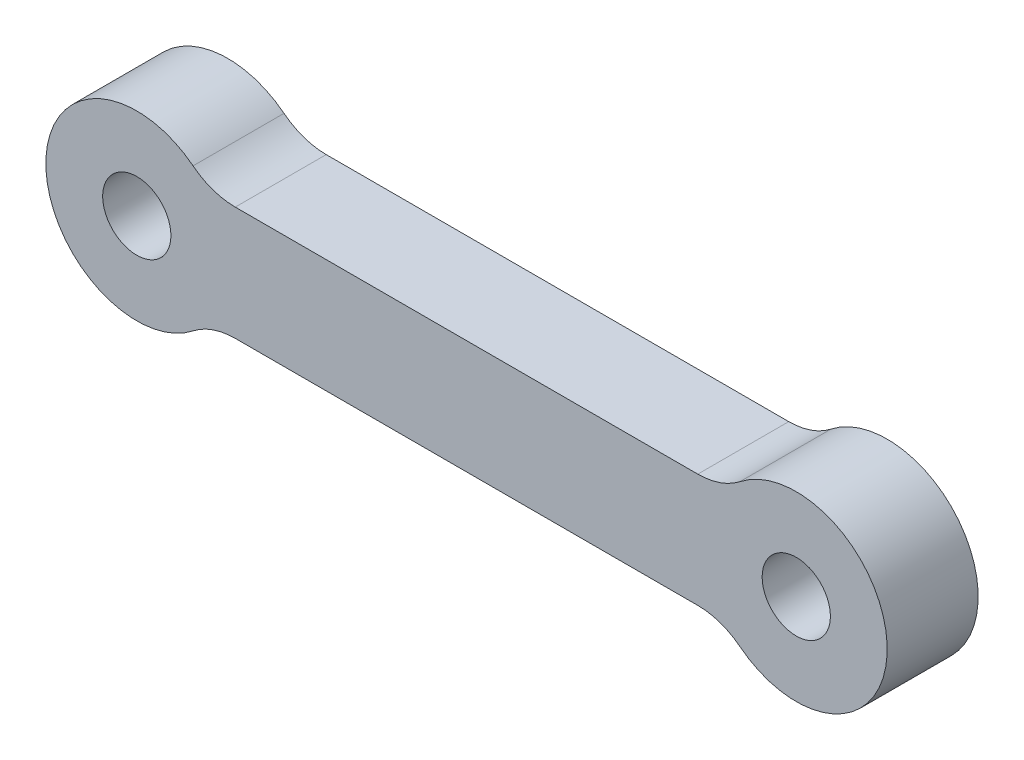
ISO-10303-21;
HEADER;
FILE_DESCRIPTION(('STEP AP214'),'2;1');
FILE_NAME('part.step','',(''),(''),'','','');
FILE_SCHEMA(('AUTOMOTIVE_DESIGN { 1 0 10303 214 1 1 1 1 }'));
ENDSEC;
DATA;
#1=APPLICATION_CONTEXT('core data for automotive mechanical design processes');
#2=APPLICATION_PROTOCOL_DEFINITION('international standard','automotive_design',2000,#1);
#3=PRODUCT_CONTEXT('',#1,'mechanical');
#4=PRODUCT('Part','Part','',(#3));
#5=PRODUCT_RELATED_PRODUCT_CATEGORY('part','',(#4));
#6=PRODUCT_DEFINITION_FORMATION('','',#4);
#7=PRODUCT_DEFINITION_CONTEXT('part definition',#1,'design');
#8=PRODUCT_DEFINITION('design','',#6,#7);
#9=PRODUCT_DEFINITION_SHAPE('','',#8);
#10=(LENGTH_UNIT() NAMED_UNIT(*) SI_UNIT(.MILLI.,.METRE.));
#11=(NAMED_UNIT(*) PLANE_ANGLE_UNIT() SI_UNIT($,.RADIAN.));
#12=(NAMED_UNIT(*) SI_UNIT($,.STERADIAN.) SOLID_ANGLE_UNIT());
#13=UNCERTAINTY_MEASURE_WITH_UNIT(LENGTH_MEASURE(1.E-05),#10,'distance_accuracy_value','');
#14=(GEOMETRIC_REPRESENTATION_CONTEXT(3) GLOBAL_UNCERTAINTY_ASSIGNED_CONTEXT((#13)) GLOBAL_UNIT_ASSIGNED_CONTEXT((#10,
#11,#12)) REPRESENTATION_CONTEXT('',''));
#15=CARTESIAN_POINT('',(0.,0.,0.));
#16=DIRECTION('',(0.,0.,1.));
#17=DIRECTION('',(1.,0.,0.));
#18=AXIS2_PLACEMENT_3D('',#15,#16,#17);
#19=CARTESIAN_POINT('',(10.1698729810778,-5.5,4.));
#20=DIRECTION('',(0.,0.,-1.));
#21=DIRECTION('',(-1.,0.,0.));
#22=AXIS2_PLACEMENT_3D('',#19,#20,#21);
#23=PLANE('',#22);
#24=CARTESIAN_POINT('',(10.1698729810778,-5.5,4.));
#25=DIRECTION('',(0.,0.,-1.));
#26=DIRECTION('',(-1.,0.,0.));
#27=AXIS2_PLACEMENT_3D('',#24,#25,#26);
#28=CIRCLE('',#27,3.);
#29=CARTESIAN_POINT('',(10.1698729810778,-2.5,4.));
#30=VERTEX_POINT('',#29);
#31=CARTESIAN_POINT('',(12.025641703473,-3.14285714285714,4.));
#32=VERTEX_POINT('',#31);
#33=EDGE_CURVE('E151',#30,#32,#28,.T.);
#34=ORIENTED_EDGE('',*,*,#33,.T.);
#35=CARTESIAN_POINT('',(14.5,0.,4.));
#36=DIRECTION('',(0.,0.,1.));
#37=DIRECTION('',(-1.,0.,0.));
#38=AXIS2_PLACEMENT_3D('',#35,#36,#37);
#39=CIRCLE('',#38,4.);
#40=CARTESIAN_POINT('',(12.025641703473,3.14285714285714,4.));
#41=VERTEX_POINT('',#40);
#42=EDGE_CURVE('E97',#32,#41,#39,.T.);
#43=ORIENTED_EDGE('',*,*,#42,.T.);
#44=CARTESIAN_POINT('',(10.1698729810778,5.5,4.));
#45=DIRECTION('',(0.,0.,-1.));
#46=DIRECTION('',(1.,0.,0.));
#47=AXIS2_PLACEMENT_3D('',#44,#45,#46);
#48=CIRCLE('',#47,3.);
#49=CARTESIAN_POINT('',(10.1698729810778,2.5,4.));
#50=VERTEX_POINT('',#49);
#51=EDGE_CURVE('E167',#41,#50,#48,.T.);
#52=ORIENTED_EDGE('',*,*,#51,.T.);
#53=DIRECTION('',(-1.,0.,0.));
#54=VECTOR('',#53,1.);
#55=CARTESIAN_POINT('',(-10.1698729810778,2.5,4.));
#56=LINE('',#55,#54);
#57=CARTESIAN_POINT('',(-10.1698729810778,2.5,4.));
#58=VERTEX_POINT('',#57);
#59=EDGE_CURVE('E176',#50,#58,#56,.T.);
#60=ORIENTED_EDGE('',*,*,#59,.T.);
#61=CARTESIAN_POINT('',(-10.1698729810778,5.5,4.));
#62=DIRECTION('',(0.,0.,-1.));
#63=DIRECTION('',(1.,0.,0.));
#64=AXIS2_PLACEMENT_3D('',#61,#62,#63);
#65=CIRCLE('',#64,3.);
#66=CARTESIAN_POINT('',(-12.025641703473,3.14285714285714,4.));
#67=VERTEX_POINT('',#66);
#68=EDGE_CURVE('E117',#58,#67,#65,.T.);
#69=ORIENTED_EDGE('',*,*,#68,.T.);
#70=CARTESIAN_POINT('',(-14.5,0.,4.));
#71=DIRECTION('',(0.,0.,1.));
#72=DIRECTION('',(1.,0.,0.));
#73=AXIS2_PLACEMENT_3D('',#70,#71,#72);
#74=CIRCLE('',#73,4.);
#75=CARTESIAN_POINT('',(-12.025641703473,-3.14285714285714,4.));
#76=VERTEX_POINT('',#75);
#77=EDGE_CURVE('E115',#67,#76,#74,.T.);
#78=ORIENTED_EDGE('',*,*,#77,.T.);
#79=CARTESIAN_POINT('',(-10.1698729810778,-5.5,4.));
#80=DIRECTION('',(0.,0.,-1.));
#81=DIRECTION('',(1.,0.,0.));
#82=AXIS2_PLACEMENT_3D('',#79,#80,#81);
#83=CIRCLE('',#82,3.);
#84=CARTESIAN_POINT('',(-10.1698729810778,-2.5,4.));
#85=VERTEX_POINT('',#84);
#86=EDGE_CURVE('E118',#76,#85,#83,.T.);
#87=ORIENTED_EDGE('',*,*,#86,.T.);
#88=DIRECTION('',(1.,0.,0.));
#89=VECTOR('',#88,1.);
#90=CARTESIAN_POINT('',(-10.1698729810778,-2.5,4.));
#91=LINE('',#90,#89);
#92=EDGE_CURVE('E57',#85,#30,#91,.T.);
#93=ORIENTED_EDGE('',*,*,#92,.T.);
#94=EDGE_LOOP('',(#34,#43,#52,#60,#69,#78,#87,#93));
#95=FACE_BOUND('',#94,.T.);
#96=CARTESIAN_POINT('',(-14.5,0.,4.));
#97=DIRECTION('',(0.,0.,1.));
#98=DIRECTION('',(1.,0.,0.));
#99=AXIS2_PLACEMENT_3D('',#96,#97,#98);
#100=CIRCLE('',#99,1.5);
#101=CARTESIAN_POINT('',(-13.,0.,4.));
#102=VERTEX_POINT('',#101);
#103=EDGE_CURVE('E138',#102,#102,#100,.T.);
#104=ORIENTED_EDGE('',*,*,#103,.F.);
#105=EDGE_LOOP('',(#104));
#106=FACE_BOUND('',#105,.T.);
#107=CARTESIAN_POINT('',(14.5,0.,4.));
#108=DIRECTION('',(0.,0.,1.));
#109=DIRECTION('',(-1.,0.,0.));
#110=AXIS2_PLACEMENT_3D('',#107,#108,#109);
#111=CIRCLE('',#110,1.49999999999998);
#112=CARTESIAN_POINT('',(13.,0.,4.));
#113=VERTEX_POINT('',#112);
#114=EDGE_CURVE('E187',#113,#113,#111,.T.);
#115=ORIENTED_EDGE('',*,*,#114,.F.);
#116=EDGE_LOOP('',(#115));
#117=FACE_BOUND('',#116,.T.);
#118=ADVANCED_FACE('F39',(#95,#106,#117),#23,.F.);
#119=CARTESIAN_POINT('',(10.1698729810778,-5.5,0.));
#120=DIRECTION('',(0.,0.,-1.));
#121=DIRECTION('',(-1.,0.,0.));
#122=AXIS2_PLACEMENT_3D('',#119,#120,#121);
#123=PLANE('',#122);
#124=CARTESIAN_POINT('',(-14.5,0.,0.));
#125=DIRECTION('',(0.,0.,1.));
#126=DIRECTION('',(1.,0.,0.));
#127=AXIS2_PLACEMENT_3D('',#124,#125,#126);
#128=CIRCLE('',#127,1.5);
#129=CARTESIAN_POINT('',(-13.,0.,0.));
#130=VERTEX_POINT('',#129);
#131=EDGE_CURVE('E183',#130,#130,#128,.T.);
#132=ORIENTED_EDGE('',*,*,#131,.T.);
#133=EDGE_LOOP('',(#132));
#134=FACE_BOUND('',#133,.T.);
#135=CARTESIAN_POINT('',(10.1698729810778,-5.5,0.));
#136=DIRECTION('',(0.,0.,-1.));
#137=DIRECTION('',(-1.,0.,0.));
#138=AXIS2_PLACEMENT_3D('',#135,#136,#137);
#139=CIRCLE('',#138,3.);
#140=CARTESIAN_POINT('',(10.1698729810778,-2.5,0.));
#141=VERTEX_POINT('',#140);
#142=CARTESIAN_POINT('',(12.025641703473,-3.14285714285714,0.));
#143=VERTEX_POINT('',#142);
#144=EDGE_CURVE('E137',#141,#143,#139,.T.);
#145=ORIENTED_EDGE('',*,*,#144,.F.);
#146=DIRECTION('',(1.,0.,0.));
#147=VECTOR('',#146,1.);
#148=CARTESIAN_POINT('',(-10.1698729810778,-2.5,0.));
#149=LINE('',#148,#147);
#150=CARTESIAN_POINT('',(-10.1698729810778,-2.5,0.));
#151=VERTEX_POINT('',#150);
#152=EDGE_CURVE('E93',#151,#141,#149,.T.);
#153=ORIENTED_EDGE('',*,*,#152,.F.);
#154=CARTESIAN_POINT('',(-10.1698729810778,-5.5,0.));
#155=DIRECTION('',(0.,0.,-1.));
#156=DIRECTION('',(1.,0.,0.));
#157=AXIS2_PLACEMENT_3D('',#154,#155,#156);
#158=CIRCLE('',#157,3.);
#159=CARTESIAN_POINT('',(-12.025641703473,-3.14285714285714,0.));
#160=VERTEX_POINT('',#159);
#161=EDGE_CURVE('E83',#160,#151,#158,.T.);
#162=ORIENTED_EDGE('',*,*,#161,.F.);
#163=CARTESIAN_POINT('',(-14.5,0.,0.));
#164=DIRECTION('',(0.,0.,1.));
#165=DIRECTION('',(1.,0.,0.));
#166=AXIS2_PLACEMENT_3D('',#163,#164,#165);
#167=CIRCLE('',#166,4.);
#168=CARTESIAN_POINT('',(-12.025641703473,3.14285714285714,0.));
#169=VERTEX_POINT('',#168);
#170=EDGE_CURVE('E127',#169,#160,#167,.T.);
#171=ORIENTED_EDGE('',*,*,#170,.F.);
#172=CARTESIAN_POINT('',(-10.1698729810778,5.5,0.));
#173=DIRECTION('',(0.,0.,-1.));
#174=DIRECTION('',(1.,0.,0.));
#175=AXIS2_PLACEMENT_3D('',#172,#173,#174);
#176=CIRCLE('',#175,3.);
#177=CARTESIAN_POINT('',(-10.1698729810778,2.5,0.));
#178=VERTEX_POINT('',#177);
#179=EDGE_CURVE('E148',#178,#169,#176,.T.);
#180=ORIENTED_EDGE('',*,*,#179,.F.);
#181=DIRECTION('',(-1.,0.,0.));
#182=VECTOR('',#181,1.);
#183=CARTESIAN_POINT('',(-10.1698729810778,2.5,0.));
#184=LINE('',#183,#182);
#185=CARTESIAN_POINT('',(10.1698729810778,2.5,0.));
#186=VERTEX_POINT('',#185);
#187=EDGE_CURVE('E145',#186,#178,#184,.T.);
#188=ORIENTED_EDGE('',*,*,#187,.F.);
#189=CARTESIAN_POINT('',(10.1698729810778,5.5,0.));
#190=DIRECTION('',(0.,0.,-1.));
#191=DIRECTION('',(1.,0.,0.));
#192=AXIS2_PLACEMENT_3D('',#189,#190,#191);
#193=CIRCLE('',#192,3.);
#194=CARTESIAN_POINT('',(12.025641703473,3.14285714285714,0.));
#195=VERTEX_POINT('',#194);
#196=EDGE_CURVE('E142',#195,#186,#193,.T.);
#197=ORIENTED_EDGE('',*,*,#196,.F.);
#198=CARTESIAN_POINT('',(14.5,0.,0.));
#199=DIRECTION('',(0.,0.,1.));
#200=DIRECTION('',(-1.,0.,0.));
#201=AXIS2_PLACEMENT_3D('',#198,#199,#200);
#202=CIRCLE('',#201,4.);
#203=EDGE_CURVE('E136',#143,#195,#202,.T.);
#204=ORIENTED_EDGE('',*,*,#203,.F.);
#205=EDGE_LOOP('',(#145,#153,#162,#171,#180,#188,#197,#204));
#206=FACE_BOUND('',#205,.T.);
#207=CARTESIAN_POINT('',(14.5,0.,0.));
#208=DIRECTION('',(0.,0.,1.));
#209=DIRECTION('',(-1.,0.,0.));
#210=AXIS2_PLACEMENT_3D('',#207,#208,#209);
#211=CIRCLE('',#210,1.49999999999998);
#212=CARTESIAN_POINT('',(13.,0.,0.));
#213=VERTEX_POINT('',#212);
#214=EDGE_CURVE('E192',#213,#213,#211,.T.);
#215=ORIENTED_EDGE('',*,*,#214,.T.);
#216=EDGE_LOOP('',(#215));
#217=FACE_BOUND('',#216,.T.);
#218=ADVANCED_FACE('F168',(#134,#206,#217),#123,.T.);
#219=CARTESIAN_POINT('',(10.1698729810778,-5.5,4.));
#220=DIRECTION('',(0.,0.,-1.));
#221=DIRECTION('',(-1.,0.,0.));
#222=AXIS2_PLACEMENT_3D('',#219,#220,#221);
#223=CYLINDRICAL_SURFACE('',#222,3.);
#224=ORIENTED_EDGE('',*,*,#144,.T.);
#225=DIRECTION('',(0.,0.,-1.));
#226=VECTOR('',#225,1.);
#227=CARTESIAN_POINT('',(12.025641703473,-3.14285714285714,4.));
#228=LINE('',#227,#226);
#229=EDGE_CURVE('E11',#32,#143,#228,.T.);
#230=ORIENTED_EDGE('',*,*,#229,.F.);
#231=ORIENTED_EDGE('',*,*,#33,.F.);
#232=DIRECTION('',(0.,0.,-1.));
#233=VECTOR('',#232,1.);
#234=CARTESIAN_POINT('',(10.1698729810778,-2.5,4.));
#235=LINE('',#234,#233);
#236=EDGE_CURVE('E134',#30,#141,#235,.T.);
#237=ORIENTED_EDGE('',*,*,#236,.T.);
#238=EDGE_LOOP('',(#224,#230,#231,#237));
#239=FACE_BOUND('',#238,.T.);
#240=ADVANCED_FACE('F41',(#239),#223,.F.);
#241=CARTESIAN_POINT('',(14.5,0.,4.));
#242=DIRECTION('',(0.,0.,-1.));
#243=DIRECTION('',(-1.,0.,0.));
#244=AXIS2_PLACEMENT_3D('',#241,#242,#243);
#245=CYLINDRICAL_SURFACE('',#244,4.);
#246=ORIENTED_EDGE('',*,*,#203,.T.);
#247=DIRECTION('',(0.,0.,-1.));
#248=VECTOR('',#247,1.);
#249=CARTESIAN_POINT('',(12.025641703473,3.14285714285714,4.));
#250=LINE('',#249,#248);
#251=EDGE_CURVE('E48',#41,#195,#250,.T.);
#252=ORIENTED_EDGE('',*,*,#251,.F.);
#253=ORIENTED_EDGE('',*,*,#42,.F.);
#254=ORIENTED_EDGE('',*,*,#229,.T.);
#255=EDGE_LOOP('',(#246,#252,#253,#254));
#256=FACE_BOUND('',#255,.T.);
#257=ADVANCED_FACE('F224',(#256),#245,.T.);
#258=CARTESIAN_POINT('',(10.1698729810778,5.5,4.));
#259=DIRECTION('',(0.,0.,-1.));
#260=DIRECTION('',(-1.,0.,0.));
#261=AXIS2_PLACEMENT_3D('',#258,#259,#260);
#262=CYLINDRICAL_SURFACE('',#261,3.);
#263=ORIENTED_EDGE('',*,*,#196,.T.);
#264=DIRECTION('',(0.,0.,-1.));
#265=VECTOR('',#264,1.);
#266=CARTESIAN_POINT('',(10.1698729810778,2.5,4.));
#267=LINE('',#266,#265);
#268=EDGE_CURVE('E158',#50,#186,#267,.T.);
#269=ORIENTED_EDGE('',*,*,#268,.F.);
#270=ORIENTED_EDGE('',*,*,#51,.F.);
#271=ORIENTED_EDGE('',*,*,#251,.T.);
#272=EDGE_LOOP('',(#263,#269,#270,#271));
#273=FACE_BOUND('',#272,.T.);
#274=ADVANCED_FACE('F163',(#273),#262,.F.);
#275=CARTESIAN_POINT('',(-10.1698729810778,2.5,4.));
#276=DIRECTION('',(0.,-1.,0.));
#277=DIRECTION('',(0.,0.,-1.));
#278=AXIS2_PLACEMENT_3D('',#275,#276,#277);
#279=PLANE('',#278);
#280=ORIENTED_EDGE('',*,*,#187,.T.);
#281=DIRECTION('',(0.,0.,-1.));
#282=VECTOR('',#281,1.);
#283=CARTESIAN_POINT('',(-10.1698729810778,2.5,4.));
#284=LINE('',#283,#282);
#285=EDGE_CURVE('E154',#58,#178,#284,.T.);
#286=ORIENTED_EDGE('',*,*,#285,.F.);
#287=ORIENTED_EDGE('',*,*,#59,.F.);
#288=ORIENTED_EDGE('',*,*,#268,.T.);
#289=EDGE_LOOP('',(#280,#286,#287,#288));
#290=FACE_BOUND('',#289,.T.);
#291=ADVANCED_FACE('F171',(#290),#279,.F.);
#292=CARTESIAN_POINT('',(-10.1698729810778,5.5,4.));
#293=DIRECTION('',(0.,0.,-1.));
#294=DIRECTION('',(-1.,0.,0.));
#295=AXIS2_PLACEMENT_3D('',#292,#293,#294);
#296=CYLINDRICAL_SURFACE('',#295,3.);
#297=ORIENTED_EDGE('',*,*,#179,.T.);
#298=DIRECTION('',(0.,0.,-1.));
#299=VECTOR('',#298,1.);
#300=CARTESIAN_POINT('',(-12.025641703473,3.14285714285714,4.));
#301=LINE('',#300,#299);
#302=EDGE_CURVE('E130',#67,#169,#301,.T.);
#303=ORIENTED_EDGE('',*,*,#302,.F.);
#304=ORIENTED_EDGE('',*,*,#68,.F.);
#305=ORIENTED_EDGE('',*,*,#285,.T.);
#306=EDGE_LOOP('',(#297,#303,#304,#305));
#307=FACE_BOUND('',#306,.T.);
#308=ADVANCED_FACE('F179',(#307),#296,.F.);
#309=CARTESIAN_POINT('',(-14.5,0.,4.));
#310=DIRECTION('',(0.,0.,-1.));
#311=DIRECTION('',(-1.,0.,0.));
#312=AXIS2_PLACEMENT_3D('',#309,#310,#311);
#313=CYLINDRICAL_SURFACE('',#312,4.);
#314=ORIENTED_EDGE('',*,*,#170,.T.);
#315=DIRECTION('',(0.,0.,-1.));
#316=VECTOR('',#315,1.);
#317=CARTESIAN_POINT('',(-12.025641703473,-3.14285714285714,4.));
#318=LINE('',#317,#316);
#319=EDGE_CURVE('E124',#76,#160,#318,.T.);
#320=ORIENTED_EDGE('',*,*,#319,.F.);
#321=ORIENTED_EDGE('',*,*,#77,.F.);
#322=ORIENTED_EDGE('',*,*,#302,.T.);
#323=EDGE_LOOP('',(#314,#320,#321,#322));
#324=FACE_BOUND('',#323,.T.);
#325=ADVANCED_FACE('F121',(#324),#313,.T.);
#326=CARTESIAN_POINT('',(-10.1698729810778,-5.5,4.));
#327=DIRECTION('',(0.,0.,-1.));
#328=DIRECTION('',(-1.,0.,0.));
#329=AXIS2_PLACEMENT_3D('',#326,#327,#328);
#330=CYLINDRICAL_SURFACE('',#329,3.);
#331=ORIENTED_EDGE('',*,*,#161,.T.);
#332=DIRECTION('',(0.,0.,-1.));
#333=VECTOR('',#332,1.);
#334=CARTESIAN_POINT('',(-10.1698729810778,-2.5,4.));
#335=LINE('',#334,#333);
#336=EDGE_CURVE('E126',#85,#151,#335,.T.);
#337=ORIENTED_EDGE('',*,*,#336,.F.);
#338=ORIENTED_EDGE('',*,*,#86,.F.);
#339=ORIENTED_EDGE('',*,*,#319,.T.);
#340=EDGE_LOOP('',(#331,#337,#338,#339));
#341=FACE_BOUND('',#340,.T.);
#342=ADVANCED_FACE('F128',(#341),#330,.F.);
#343=CARTESIAN_POINT('',(-10.1698729810778,-2.5,4.));
#344=DIRECTION('',(0.,1.,0.));
#345=DIRECTION('',(0.,0.,1.));
#346=AXIS2_PLACEMENT_3D('',#343,#344,#345);
#347=PLANE('',#346);
#348=ORIENTED_EDGE('',*,*,#152,.T.);
#349=ORIENTED_EDGE('',*,*,#236,.F.);
#350=ORIENTED_EDGE('',*,*,#92,.F.);
#351=ORIENTED_EDGE('',*,*,#336,.T.);
#352=EDGE_LOOP('',(#348,#349,#350,#351));
#353=FACE_BOUND('',#352,.T.);
#354=ADVANCED_FACE('F211',(#353),#347,.F.);
#355=CARTESIAN_POINT('',(-14.5,0.,4.));
#356=DIRECTION('',(0.,0.,-1.));
#357=DIRECTION('',(-1.,0.,0.));
#358=AXIS2_PLACEMENT_3D('',#355,#356,#357);
#359=CYLINDRICAL_SURFACE('',#358,1.5);
#360=ORIENTED_EDGE('',*,*,#103,.T.);
#361=EDGE_LOOP('',(#360));
#362=FACE_BOUND('',#361,.T.);
#363=ORIENTED_EDGE('',*,*,#131,.F.);
#364=EDGE_LOOP('',(#363));
#365=FACE_BOUND('',#364,.T.);
#366=ADVANCED_FACE('F208',(#362,#365),#359,.F.);
#367=CARTESIAN_POINT('',(14.5,0.,4.));
#368=DIRECTION('',(0.,0.,-1.));
#369=DIRECTION('',(-1.,0.,0.));
#370=AXIS2_PLACEMENT_3D('',#367,#368,#369);
#371=CYLINDRICAL_SURFACE('',#370,1.49999999999998);
#372=ORIENTED_EDGE('',*,*,#114,.T.);
#373=EDGE_LOOP('',(#372));
#374=FACE_BOUND('',#373,.T.);
#375=ORIENTED_EDGE('',*,*,#214,.F.);
#376=EDGE_LOOP('',(#375));
#377=FACE_BOUND('',#376,.T.);
#378=ADVANCED_FACE('F197',(#374,#377),#371,.F.);
#379=CLOSED_SHELL('',(#118,#218,#240,#257,#274,#291,#308,#325,#342,#354,#366,#378));
#380=MANIFOLD_SOLID_BREP('B2',#379);
#381=ADVANCED_BREP_SHAPE_REPRESENTATION('',(#18,#380),#14);
#382=SHAPE_DEFINITION_REPRESENTATION(#9,#381);
ENDSEC;
END-ISO-10303-21;
